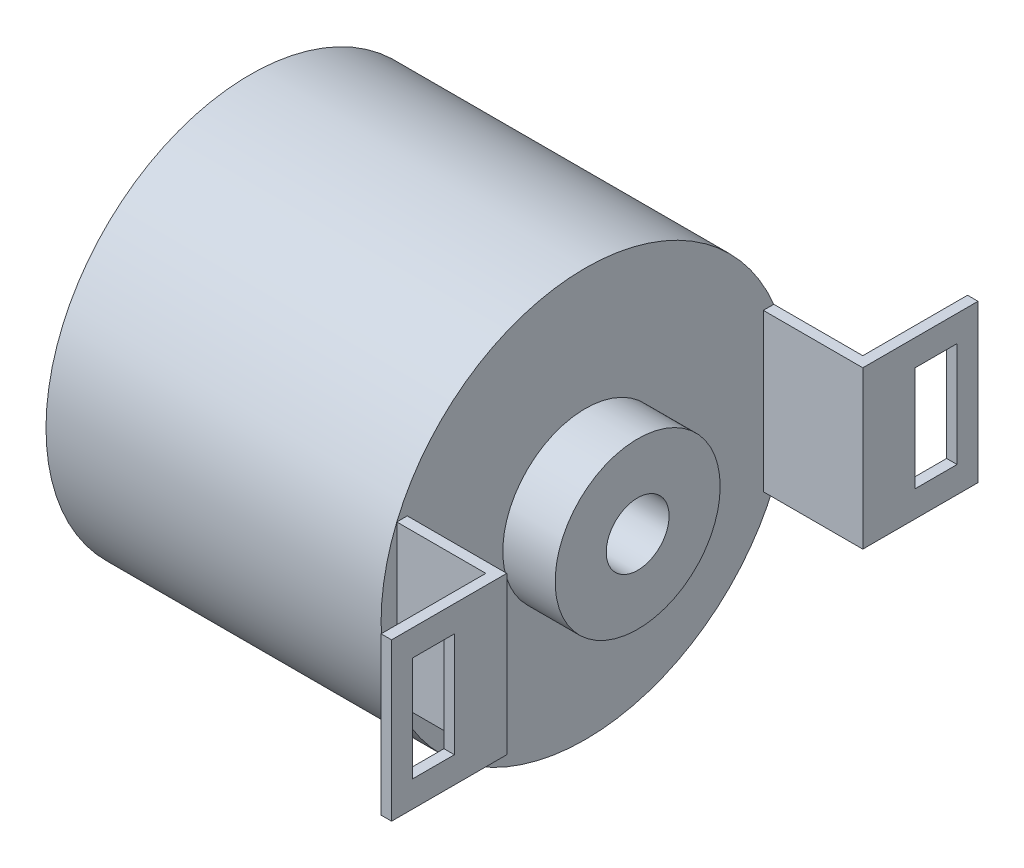
ISO-10303-21;
HEADER;
FILE_DESCRIPTION(('STEP AP214'),'2;1');
FILE_NAME('part.step','',(''),(''),'','','');
FILE_SCHEMA(('AUTOMOTIVE_DESIGN { 1 0 10303 214 1 1 1 1 }'));
ENDSEC;
DATA;
#1=APPLICATION_CONTEXT('core data for automotive mechanical design processes');
#2=APPLICATION_PROTOCOL_DEFINITION('international standard','automotive_design',2000,#1);
#3=PRODUCT_CONTEXT('',#1,'mechanical');
#4=PRODUCT('Part','Part','',(#3));
#5=PRODUCT_RELATED_PRODUCT_CATEGORY('part','',(#4));
#6=PRODUCT_DEFINITION_FORMATION('','',#4);
#7=PRODUCT_DEFINITION_CONTEXT('part definition',#1,'design');
#8=PRODUCT_DEFINITION('design','',#6,#7);
#9=PRODUCT_DEFINITION_SHAPE('','',#8);
#10=(LENGTH_UNIT() NAMED_UNIT(*) SI_UNIT(.MILLI.,.METRE.));
#11=(NAMED_UNIT(*) PLANE_ANGLE_UNIT() SI_UNIT($,.RADIAN.));
#12=(NAMED_UNIT(*) SI_UNIT($,.STERADIAN.) SOLID_ANGLE_UNIT());
#13=UNCERTAINTY_MEASURE_WITH_UNIT(LENGTH_MEASURE(1.E-05),#10,'distance_accuracy_value','');
#14=(GEOMETRIC_REPRESENTATION_CONTEXT(3) GLOBAL_UNCERTAINTY_ASSIGNED_CONTEXT((#13)) GLOBAL_UNIT_ASSIGNED_CONTEXT((#10,
#11,#12)) REPRESENTATION_CONTEXT('',''));
#15=CARTESIAN_POINT('',(0.,0.,0.));
#16=DIRECTION('',(0.,0.,1.));
#17=DIRECTION('',(1.,0.,0.));
#18=AXIS2_PLACEMENT_3D('',#15,#16,#17);
#19=CARTESIAN_POINT('',(41.5,0.,0.));
#20=DIRECTION('',(-1.,0.,0.));
#21=DIRECTION('',(0.,0.,-1.));
#22=AXIS2_PLACEMENT_3D('',#19,#20,#21);
#23=PLANE('',#22);
#24=DIRECTION('',(0.,0.,-1.));
#25=VECTOR('',#24,1.);
#26=CARTESIAN_POINT('',(41.5,7.5,17.));
#27=LINE('',#26,#25);
#28=CARTESIAN_POINT('',(41.5,7.5,28.));
#29=VERTEX_POINT('',#28);
#30=CARTESIAN_POINT('',(41.5,7.5,17.));
#31=VERTEX_POINT('',#30);
#32=EDGE_CURVE('E224',#29,#31,#27,.T.);
#33=ORIENTED_EDGE('',*,*,#32,.F.);
#34=DIRECTION('',(0.,-1.,0.));
#35=VECTOR('',#34,1.);
#36=CARTESIAN_POINT('',(41.5,7.5,28.));
#37=LINE('',#36,#35);
#38=CARTESIAN_POINT('',(41.5,-7.5,28.));
#39=VERTEX_POINT('',#38);
#40=EDGE_CURVE('E204',#29,#39,#37,.T.);
#41=ORIENTED_EDGE('',*,*,#40,.T.);
#42=DIRECTION('',(0.,0.,1.));
#43=VECTOR('',#42,1.);
#44=CARTESIAN_POINT('',(41.5,-7.5,18.));
#45=LINE('',#44,#43);
#46=CARTESIAN_POINT('',(41.5,-7.5,17.));
#47=VERTEX_POINT('',#46);
#48=EDGE_CURVE('E227',#47,#39,#45,.T.);
#49=ORIENTED_EDGE('',*,*,#48,.F.);
#50=DIRECTION('',(0.,-1.,0.));
#51=VECTOR('',#50,1.);
#52=CARTESIAN_POINT('',(41.5,-7.5,17.));
#53=LINE('',#52,#51);
#54=EDGE_CURVE('E230',#31,#47,#53,.T.);
#55=ORIENTED_EDGE('',*,*,#54,.F.);
#56=EDGE_LOOP('',(#33,#41,#49,#55));
#57=FACE_BOUND('',#56,.T.);
#58=DIRECTION('',(0.,-1.,0.));
#59=VECTOR('',#58,1.);
#60=CARTESIAN_POINT('',(41.5,5.,22.));
#61=LINE('',#60,#59);
#62=CARTESIAN_POINT('',(41.5,5.,22.));
#63=VERTEX_POINT('',#62);
#64=CARTESIAN_POINT('',(41.5,-5.,22.));
#65=VERTEX_POINT('',#64);
#66=EDGE_CURVE('E55',#63,#65,#61,.T.);
#67=ORIENTED_EDGE('',*,*,#66,.T.);
#68=DIRECTION('',(0.,0.,1.));
#69=VECTOR('',#68,1.);
#70=CARTESIAN_POINT('',(41.5,-5.,22.));
#71=LINE('',#70,#69);
#72=CARTESIAN_POINT('',(41.5,-5.,26.));
#73=VERTEX_POINT('',#72);
#74=EDGE_CURVE('E194',#65,#73,#71,.T.);
#75=ORIENTED_EDGE('',*,*,#74,.T.);
#76=DIRECTION('',(0.,1.,0.));
#77=VECTOR('',#76,1.);
#78=CARTESIAN_POINT('',(41.5,5.,26.));
#79=LINE('',#78,#77);
#80=CARTESIAN_POINT('',(41.5,5.,26.));
#81=VERTEX_POINT('',#80);
#82=EDGE_CURVE('E180',#73,#81,#79,.T.);
#83=ORIENTED_EDGE('',*,*,#82,.T.);
#84=DIRECTION('',(0.,0.,-1.));
#85=VECTOR('',#84,1.);
#86=CARTESIAN_POINT('',(41.5,5.,22.));
#87=LINE('',#86,#85);
#88=EDGE_CURVE('E189',#81,#63,#87,.T.);
#89=ORIENTED_EDGE('',*,*,#88,.T.);
#90=EDGE_LOOP('',(#67,#75,#83,#89));
#91=FACE_BOUND('',#90,.T.);
#92=ADVANCED_FACE('F40',(#57,#91),#23,.F.);
#93=CARTESIAN_POINT('',(40.5,7.5,28.));
#94=DIRECTION('',(-1.,0.,0.));
#95=DIRECTION('',(0.,0.,1.));
#96=AXIS2_PLACEMENT_3D('',#93,#94,#95);
#97=PLANE('',#96);
#98=DIRECTION('',(0.,1.,0.));
#99=VECTOR('',#98,1.);
#100=CARTESIAN_POINT('',(40.5,7.5,18.));
#101=LINE('',#100,#99);
#102=CARTESIAN_POINT('',(40.5,-7.5,18.));
#103=VERTEX_POINT('',#102);
#104=CARTESIAN_POINT('',(40.5,7.5,18.));
#105=VERTEX_POINT('',#104);
#106=EDGE_CURVE('E201',#103,#105,#101,.T.);
#107=ORIENTED_EDGE('',*,*,#106,.F.);
#108=DIRECTION('',(0.,0.,-1.));
#109=VECTOR('',#108,1.);
#110=CARTESIAN_POINT('',(40.5,-7.5,28.));
#111=LINE('',#110,#109);
#112=CARTESIAN_POINT('',(40.5,-7.5,28.));
#113=VERTEX_POINT('',#112);
#114=EDGE_CURVE('E216',#113,#103,#111,.T.);
#115=ORIENTED_EDGE('',*,*,#114,.F.);
#116=DIRECTION('',(0.,1.,0.));
#117=VECTOR('',#116,1.);
#118=CARTESIAN_POINT('',(40.5,7.5,28.));
#119=LINE('',#118,#117);
#120=CARTESIAN_POINT('',(40.5,7.5,28.));
#121=VERTEX_POINT('',#120);
#122=EDGE_CURVE('E210',#113,#121,#119,.T.);
#123=ORIENTED_EDGE('',*,*,#122,.T.);
#124=DIRECTION('',(0.,0.,-1.));
#125=VECTOR('',#124,1.);
#126=CARTESIAN_POINT('',(40.5,7.5,28.));
#127=LINE('',#126,#125);
#128=EDGE_CURVE('E220',#121,#105,#127,.T.);
#129=ORIENTED_EDGE('',*,*,#128,.T.);
#130=EDGE_LOOP('',(#107,#115,#123,#129));
#131=FACE_BOUND('',#130,.T.);
#132=DIRECTION('',(0.,0.,-1.));
#133=VECTOR('',#132,1.);
#134=CARTESIAN_POINT('',(40.5,-5.,28.));
#135=LINE('',#134,#133);
#136=CARTESIAN_POINT('',(40.5,-5.,26.));
#137=VERTEX_POINT('',#136);
#138=CARTESIAN_POINT('',(40.5,-5.,22.));
#139=VERTEX_POINT('',#138);
#140=EDGE_CURVE('E48',#137,#139,#135,.T.);
#141=ORIENTED_EDGE('',*,*,#140,.T.);
#142=DIRECTION('',(0.,1.,0.));
#143=VECTOR('',#142,1.);
#144=CARTESIAN_POINT('',(40.5,7.5,22.));
#145=LINE('',#144,#143);
#146=CARTESIAN_POINT('',(40.5,5.,22.));
#147=VERTEX_POINT('',#146);
#148=EDGE_CURVE('E11',#139,#147,#145,.T.);
#149=ORIENTED_EDGE('',*,*,#148,.T.);
#150=DIRECTION('',(0.,0.,1.));
#151=VECTOR('',#150,1.);
#152=CARTESIAN_POINT('',(40.5,5.,28.));
#153=LINE('',#152,#151);
#154=CARTESIAN_POINT('',(40.5,5.,26.));
#155=VERTEX_POINT('',#154);
#156=EDGE_CURVE('E349',#147,#155,#153,.T.);
#157=ORIENTED_EDGE('',*,*,#156,.T.);
#158=DIRECTION('',(0.,-1.,0.));
#159=VECTOR('',#158,1.);
#160=CARTESIAN_POINT('',(40.5,7.5,26.));
#161=LINE('',#160,#159);
#162=EDGE_CURVE('E183',#155,#137,#161,.T.);
#163=ORIENTED_EDGE('',*,*,#162,.T.);
#164=EDGE_LOOP('',(#141,#149,#157,#163));
#165=FACE_BOUND('',#164,.T.);
#166=ADVANCED_FACE('F353',(#131,#165),#97,.T.);
#167=CARTESIAN_POINT('',(32.,0.,0.));
#168=DIRECTION('',(1.,0.,0.));
#169=DIRECTION('',(0.,0.,-1.));
#170=AXIS2_PLACEMENT_3D('',#167,#168,#169);
#171=PLANE('',#170);
#172=DIRECTION('',(0.,0.,-1.));
#173=VECTOR('',#172,1.);
#174=CARTESIAN_POINT('',(32.,7.5,17.));
#175=LINE('',#174,#173);
#176=CARTESIAN_POINT('',(32.,7.5,18.));
#177=VERTEX_POINT('',#176);
#178=CARTESIAN_POINT('',(32.,7.5,17.));
#179=VERTEX_POINT('',#178);
#180=EDGE_CURVE('E223',#177,#179,#175,.T.);
#181=ORIENTED_EDGE('',*,*,#180,.T.);
#182=DIRECTION('',(0.,-1.,0.));
#183=VECTOR('',#182,1.);
#184=CARTESIAN_POINT('',(32.,-7.5,17.));
#185=LINE('',#184,#183);
#186=CARTESIAN_POINT('',(32.,-7.5,17.));
#187=VERTEX_POINT('',#186);
#188=EDGE_CURVE('E228',#179,#187,#185,.T.);
#189=ORIENTED_EDGE('',*,*,#188,.T.);
#190=DIRECTION('',(0.,0.,1.));
#191=VECTOR('',#190,1.);
#192=CARTESIAN_POINT('',(32.,-7.5,18.));
#193=LINE('',#192,#191);
#194=CARTESIAN_POINT('',(32.,-7.5,18.));
#195=VERTEX_POINT('',#194);
#196=EDGE_CURVE('E238',#187,#195,#193,.T.);
#197=ORIENTED_EDGE('',*,*,#196,.T.);
#198=CARTESIAN_POINT('',(32.,0.,0.));
#199=DIRECTION('',(1.,0.,0.));
#200=DIRECTION('',(0.,0.,-1.));
#201=AXIS2_PLACEMENT_3D('',#198,#199,#200);
#202=CIRCLE('',#201,19.5);
#203=CARTESIAN_POINT('',(32.,-7.5,-18.));
#204=VERTEX_POINT('',#203);
#205=EDGE_CURVE('E334',#195,#204,#202,.T.);
#206=ORIENTED_EDGE('',*,*,#205,.T.);
#207=DIRECTION('',(0.,0.,-1.));
#208=VECTOR('',#207,1.);
#209=CARTESIAN_POINT('',(32.,-7.5,-18.));
#210=LINE('',#209,#208);
#211=CARTESIAN_POINT('',(32.,-7.5,-17.));
#212=VERTEX_POINT('',#211);
#213=EDGE_CURVE('E302',#212,#204,#210,.T.);
#214=ORIENTED_EDGE('',*,*,#213,.F.);
#215=DIRECTION('',(0.,-1.,0.));
#216=VECTOR('',#215,1.);
#217=CARTESIAN_POINT('',(32.,-7.5,-17.));
#218=LINE('',#217,#216);
#219=CARTESIAN_POINT('',(32.,7.5,-17.));
#220=VERTEX_POINT('',#219);
#221=EDGE_CURVE('E300',#220,#212,#218,.T.);
#222=ORIENTED_EDGE('',*,*,#221,.F.);
#223=DIRECTION('',(0.,0.,1.));
#224=VECTOR('',#223,1.);
#225=CARTESIAN_POINT('',(32.,7.5,-17.));
#226=LINE('',#225,#224);
#227=CARTESIAN_POINT('',(32.,7.5,-18.));
#228=VERTEX_POINT('',#227);
#229=EDGE_CURVE('E288',#228,#220,#226,.T.);
#230=ORIENTED_EDGE('',*,*,#229,.F.);
#231=EDGE_CURVE('E330',#228,#177,#202,.T.);
#232=ORIENTED_EDGE('',*,*,#231,.T.);
#233=EDGE_LOOP('',(#181,#189,#197,#206,#214,#222,#230,#232));
#234=FACE_BOUND('',#233,.T.);
#235=CARTESIAN_POINT('',(32.,0.,0.));
#236=DIRECTION('',(1.,0.,0.));
#237=DIRECTION('',(0.,0.,-1.));
#238=AXIS2_PLACEMENT_3D('',#235,#236,#237);
#239=CIRCLE('',#238,7.88);
#240=CARTESIAN_POINT('',(32.,0.,-7.88));
#241=VERTEX_POINT('',#240);
#242=EDGE_CURVE('E326',#241,#241,#239,.T.);
#243=ORIENTED_EDGE('',*,*,#242,.F.);
#244=EDGE_LOOP('',(#243));
#245=FACE_BOUND('',#244,.T.);
#246=ADVANCED_FACE('F376',(#234,#245),#171,.T.);
#247=CARTESIAN_POINT('',(41.5,7.5,-18.));
#248=DIRECTION('',(0.,0.,1.));
#249=DIRECTION('',(1.,0.,0.));
#250=AXIS2_PLACEMENT_3D('',#247,#248,#249);
#251=PLANE('',#250);
#252=DIRECTION('',(0.,1.,0.));
#253=VECTOR('',#252,1.);
#254=CARTESIAN_POINT('',(40.5,7.5,-18.));
#255=LINE('',#254,#253);
#256=CARTESIAN_POINT('',(40.5,-7.5,-18.));
#257=VERTEX_POINT('',#256);
#258=CARTESIAN_POINT('',(40.5,7.5,-18.));
#259=VERTEX_POINT('',#258);
#260=EDGE_CURVE('E265',#257,#259,#255,.T.);
#261=ORIENTED_EDGE('',*,*,#260,.F.);
#262=DIRECTION('',(-1.,0.,0.));
#263=VECTOR('',#262,1.);
#264=CARTESIAN_POINT('',(41.5,-7.5,-18.));
#265=LINE('',#264,#263);
#266=EDGE_CURVE('E308',#257,#204,#265,.T.);
#267=ORIENTED_EDGE('',*,*,#266,.T.);
#268=DIRECTION('',(0.,1.,0.));
#269=VECTOR('',#268,1.);
#270=CARTESIAN_POINT('',(32.,7.5,-18.));
#271=LINE('',#270,#269);
#272=EDGE_CURVE('E293',#204,#228,#271,.T.);
#273=ORIENTED_EDGE('',*,*,#272,.T.);
#274=DIRECTION('',(-1.,0.,0.));
#275=VECTOR('',#274,1.);
#276=CARTESIAN_POINT('',(41.5,7.5,-18.));
#277=LINE('',#276,#275);
#278=EDGE_CURVE('E297',#259,#228,#277,.T.);
#279=ORIENTED_EDGE('',*,*,#278,.F.);
#280=EDGE_LOOP('',(#261,#267,#273,#279));
#281=FACE_BOUND('',#280,.T.);
#282=ADVANCED_FACE('F424',(#281),#251,.F.);
#283=DIRECTION('',(0.,1.,0.));
#284=VECTOR('',#283,1.);
#285=CARTESIAN_POINT('',(32.,7.5,18.));
#286=LINE('',#285,#284);
#287=EDGE_CURVE('E235',#195,#177,#286,.T.);
#288=ORIENTED_EDGE('',*,*,#287,.T.);
#289=EDGE_CURVE('E333',#177,#195,#202,.T.);
#290=ORIENTED_EDGE('',*,*,#289,.T.);
#291=EDGE_LOOP('',(#288,#290));
#292=FACE_BOUND('',#291,.T.);
#293=ADVANCED_FACE('F427',(#292),#171,.T.);
#294=EDGE_CURVE('E335',#204,#228,#202,.T.);
#295=ORIENTED_EDGE('',*,*,#294,.T.);
#296=ORIENTED_EDGE('',*,*,#272,.F.);
#297=EDGE_LOOP('',(#295,#296));
#298=FACE_BOUND('',#297,.T.);
#299=ADVANCED_FACE('F454',(#298),#171,.T.);
#300=CARTESIAN_POINT('',(32.,0.,0.));
#301=DIRECTION('',(-1.,0.,0.));
#302=DIRECTION('',(0.,0.,1.));
#303=AXIS2_PLACEMENT_3D('',#300,#301,#302);
#304=CYLINDRICAL_SURFACE('',#303,19.5);
#305=ORIENTED_EDGE('',*,*,#231,.F.);
#306=ORIENTED_EDGE('',*,*,#294,.F.);
#307=ORIENTED_EDGE('',*,*,#205,.F.);
#308=ORIENTED_EDGE('',*,*,#289,.F.);
#309=EDGE_LOOP('',(#305,#306,#307,#308));
#310=FACE_BOUND('',#309,.T.);
#311=CARTESIAN_POINT('',(0.,0.,0.));
#312=DIRECTION('',(1.,0.,0.));
#313=DIRECTION('',(0.,0.,-1.));
#314=AXIS2_PLACEMENT_3D('',#311,#312,#313);
#315=CIRCLE('',#314,19.5);
#316=CARTESIAN_POINT('',(0.,0.,-19.5));
#317=VERTEX_POINT('',#316);
#318=EDGE_CURVE('E325',#317,#317,#315,.T.);
#319=ORIENTED_EDGE('',*,*,#318,.T.);
#320=EDGE_LOOP('',(#319));
#321=FACE_BOUND('',#320,.T.);
#322=ADVANCED_FACE('F42',(#310,#321),#304,.T.);
#323=CARTESIAN_POINT('',(0.,0.,0.));
#324=DIRECTION('',(1.,0.,0.));
#325=DIRECTION('',(0.,0.,-1.));
#326=AXIS2_PLACEMENT_3D('',#323,#324,#325);
#327=PLANE('',#326);
#328=CARTESIAN_POINT('',(0.,0.,0.));
#329=DIRECTION('',(1.,0.,0.));
#330=DIRECTION('',(0.,0.,-1.));
#331=AXIS2_PLACEMENT_3D('',#328,#329,#330);
#332=CIRCLE('',#331,3.);
#333=CARTESIAN_POINT('',(0.,0.,-3.));
#334=VERTEX_POINT('',#333);
#335=EDGE_CURVE('E319',#334,#334,#332,.F.);
#336=ORIENTED_EDGE('',*,*,#335,.F.);
#337=EDGE_LOOP('',(#336));
#338=FACE_BOUND('',#337,.T.);
#339=ORIENTED_EDGE('',*,*,#318,.F.);
#340=EDGE_LOOP('',(#339));
#341=FACE_BOUND('',#340,.T.);
#342=ADVANCED_FACE('F451',(#338,#341),#327,.F.);
#343=CARTESIAN_POINT('',(37.,0.,0.));
#344=DIRECTION('',(-1.,0.,0.));
#345=DIRECTION('',(0.,0.,1.));
#346=AXIS2_PLACEMENT_3D('',#343,#344,#345);
#347=CYLINDRICAL_SURFACE('',#346,7.88);
#348=CARTESIAN_POINT('',(37.,0.,0.));
#349=DIRECTION('',(1.,0.,0.));
#350=DIRECTION('',(0.,0.,-1.));
#351=AXIS2_PLACEMENT_3D('',#348,#349,#350);
#352=CIRCLE('',#351,7.88);
#353=CARTESIAN_POINT('',(37.,0.,-7.88));
#354=VERTEX_POINT('',#353);
#355=EDGE_CURVE('E322',#354,#354,#352,.T.);
#356=ORIENTED_EDGE('',*,*,#355,.F.);
#357=EDGE_LOOP('',(#356));
#358=FACE_BOUND('',#357,.T.);
#359=ORIENTED_EDGE('',*,*,#242,.T.);
#360=EDGE_LOOP('',(#359));
#361=FACE_BOUND('',#360,.T.);
#362=ADVANCED_FACE('F447',(#358,#361),#347,.T.);
#363=CARTESIAN_POINT('',(37.,0.,0.));
#364=DIRECTION('',(1.,0.,0.));
#365=DIRECTION('',(0.,0.,-1.));
#366=AXIS2_PLACEMENT_3D('',#363,#364,#365);
#367=PLANE('',#366);
#368=CARTESIAN_POINT('',(37.,0.,0.));
#369=DIRECTION('',(1.,0.,0.));
#370=DIRECTION('',(0.,0.,-1.));
#371=AXIS2_PLACEMENT_3D('',#368,#369,#370);
#372=CIRCLE('',#371,3.);
#373=CARTESIAN_POINT('',(37.,0.,-3.));
#374=VERTEX_POINT('',#373);
#375=EDGE_CURVE('E316',#374,#374,#372,.T.);
#376=ORIENTED_EDGE('',*,*,#375,.F.);
#377=EDGE_LOOP('',(#376));
#378=FACE_BOUND('',#377,.T.);
#379=ORIENTED_EDGE('',*,*,#355,.T.);
#380=EDGE_LOOP('',(#379));
#381=FACE_BOUND('',#380,.T.);
#382=ADVANCED_FACE('F443',(#378,#381),#367,.T.);
#383=CARTESIAN_POINT('',(-0.001000000000001,0.,0.));
#384=DIRECTION('',(1.,0.,0.));
#385=DIRECTION('',(0.,0.,-1.));
#386=AXIS2_PLACEMENT_3D('',#383,#384,#385);
#387=CYLINDRICAL_SURFACE('',#386,3.);
#388=ORIENTED_EDGE('',*,*,#375,.T.);
#389=EDGE_LOOP('',(#388));
#390=FACE_BOUND('',#389,.T.);
#391=ORIENTED_EDGE('',*,*,#335,.T.);
#392=EDGE_LOOP('',(#391));
#393=FACE_BOUND('',#392,.T.);
#394=ADVANCED_FACE('F439',(#390,#393),#387,.F.);
#395=CARTESIAN_POINT('',(41.5,7.5,-17.));
#396=DIRECTION('',(0.,-1.,0.));
#397=DIRECTION('',(0.,0.,-1.));
#398=AXIS2_PLACEMENT_3D('',#395,#396,#397);
#399=PLANE('',#398);
#400=ORIENTED_EDGE('',*,*,#229,.T.);
#401=DIRECTION('',(-1.,0.,0.));
#402=VECTOR('',#401,1.);
#403=CARTESIAN_POINT('',(41.5,7.5,-17.));
#404=LINE('',#403,#402);
#405=CARTESIAN_POINT('',(41.5,7.5,-17.));
#406=VERTEX_POINT('',#405);
#407=EDGE_CURVE('E314',#406,#220,#404,.T.);
#408=ORIENTED_EDGE('',*,*,#407,.F.);
#409=DIRECTION('',(0.,0.,1.));
#410=VECTOR('',#409,1.);
#411=CARTESIAN_POINT('',(41.5,7.5,-17.));
#412=LINE('',#411,#410);
#413=CARTESIAN_POINT('',(41.5,7.5,-28.));
#414=VERTEX_POINT('',#413);
#415=EDGE_CURVE('E289',#414,#406,#412,.T.);
#416=ORIENTED_EDGE('',*,*,#415,.F.);
#417=DIRECTION('',(1.,0.,0.));
#418=VECTOR('',#417,1.);
#419=CARTESIAN_POINT('',(41.5,7.5,-28.));
#420=LINE('',#419,#418);
#421=CARTESIAN_POINT('',(40.5,7.5,-28.));
#422=VERTEX_POINT('',#421);
#423=EDGE_CURVE('E279',#422,#414,#420,.T.);
#424=ORIENTED_EDGE('',*,*,#423,.F.);
#425=DIRECTION('',(0.,0.,1.));
#426=VECTOR('',#425,1.);
#427=CARTESIAN_POINT('',(40.5,7.5,-28.));
#428=LINE('',#427,#426);
#429=EDGE_CURVE('E282',#422,#259,#428,.T.);
#430=ORIENTED_EDGE('',*,*,#429,.T.);
#431=ORIENTED_EDGE('',*,*,#278,.T.);
#432=EDGE_LOOP('',(#400,#408,#416,#424,#430,#431));
#433=FACE_BOUND('',#432,.T.);
#434=ADVANCED_FACE('F435',(#433),#399,.F.);
#435=CARTESIAN_POINT('',(41.5,-7.5,-17.));
#436=DIRECTION('',(0.,0.,-1.));
#437=DIRECTION('',(-1.,0.,0.));
#438=AXIS2_PLACEMENT_3D('',#435,#436,#437);
#439=PLANE('',#438);
#440=ORIENTED_EDGE('',*,*,#221,.T.);
#441=DIRECTION('',(-1.,0.,0.));
#442=VECTOR('',#441,1.);
#443=CARTESIAN_POINT('',(41.5,-7.5,-17.));
#444=LINE('',#443,#442);
#445=CARTESIAN_POINT('',(41.5,-7.5,-17.));
#446=VERTEX_POINT('',#445);
#447=EDGE_CURVE('E311',#446,#212,#444,.T.);
#448=ORIENTED_EDGE('',*,*,#447,.F.);
#449=DIRECTION('',(0.,-1.,0.));
#450=VECTOR('',#449,1.);
#451=CARTESIAN_POINT('',(41.5,-7.5,-17.));
#452=LINE('',#451,#450);
#453=EDGE_CURVE('E292',#406,#446,#452,.T.);
#454=ORIENTED_EDGE('',*,*,#453,.F.);
#455=ORIENTED_EDGE('',*,*,#407,.T.);
#456=EDGE_LOOP('',(#440,#448,#454,#455));
#457=FACE_BOUND('',#456,.T.);
#458=ADVANCED_FACE('F431',(#457),#439,.F.);
#459=CARTESIAN_POINT('',(41.5,-7.5,-18.));
#460=DIRECTION('',(0.,1.,0.));
#461=DIRECTION('',(0.,0.,1.));
#462=AXIS2_PLACEMENT_3D('',#459,#460,#461);
#463=PLANE('',#462);
#464=ORIENTED_EDGE('',*,*,#213,.T.);
#465=ORIENTED_EDGE('',*,*,#266,.F.);
#466=DIRECTION('',(0.,0.,1.));
#467=VECTOR('',#466,1.);
#468=CARTESIAN_POINT('',(40.5,-7.5,-28.));
#469=LINE('',#468,#467);
#470=CARTESIAN_POINT('',(40.5,-7.5,-28.));
#471=VERTEX_POINT('',#470);
#472=EDGE_CURVE('E286',#471,#257,#469,.T.);
#473=ORIENTED_EDGE('',*,*,#472,.F.);
#474=DIRECTION('',(-1.,0.,0.));
#475=VECTOR('',#474,1.);
#476=CARTESIAN_POINT('',(41.5,-7.5,-28.));
#477=LINE('',#476,#475);
#478=CARTESIAN_POINT('',(41.5,-7.5,-28.));
#479=VERTEX_POINT('',#478);
#480=EDGE_CURVE('E275',#479,#471,#477,.T.);
#481=ORIENTED_EDGE('',*,*,#480,.F.);
#482=DIRECTION('',(0.,0.,-1.));
#483=VECTOR('',#482,1.);
#484=CARTESIAN_POINT('',(41.5,-7.5,-18.));
#485=LINE('',#484,#483);
#486=EDGE_CURVE('E295',#446,#479,#485,.T.);
#487=ORIENTED_EDGE('',*,*,#486,.F.);
#488=ORIENTED_EDGE('',*,*,#447,.T.);
#489=EDGE_LOOP('',(#464,#465,#473,#481,#487,#488));
#490=FACE_BOUND('',#489,.T.);
#491=ADVANCED_FACE('F422',(#490),#463,.F.);
#492=CARTESIAN_POINT('',(41.5,0.,0.));
#493=DIRECTION('',(-1.,0.,0.));
#494=DIRECTION('',(0.,0.,1.));
#495=AXIS2_PLACEMENT_3D('',#492,#493,#494);
#496=PLANE('',#495);
#497=DIRECTION('',(0.,0.,-1.));
#498=VECTOR('',#497,1.);
#499=CARTESIAN_POINT('',(41.5,-5.,-22.));
#500=LINE('',#499,#498);
#501=CARTESIAN_POINT('',(41.5,-5.,-22.));
#502=VERTEX_POINT('',#501);
#503=CARTESIAN_POINT('',(41.5,-5.,-26.));
#504=VERTEX_POINT('',#503);
#505=EDGE_CURVE('E253',#502,#504,#500,.T.);
#506=ORIENTED_EDGE('',*,*,#505,.F.);
#507=DIRECTION('',(0.,-1.,0.));
#508=VECTOR('',#507,1.);
#509=CARTESIAN_POINT('',(41.5,5.,-22.));
#510=LINE('',#509,#508);
#511=CARTESIAN_POINT('',(41.5,5.,-22.));
#512=VERTEX_POINT('',#511);
#513=EDGE_CURVE('E251',#512,#502,#510,.T.);
#514=ORIENTED_EDGE('',*,*,#513,.F.);
#515=DIRECTION('',(0.,0.,1.));
#516=VECTOR('',#515,1.);
#517=CARTESIAN_POINT('',(41.5,5.,-22.));
#518=LINE('',#517,#516);
#519=CARTESIAN_POINT('',(41.5,5.,-26.));
#520=VERTEX_POINT('',#519);
#521=EDGE_CURVE('E259',#520,#512,#518,.T.);
#522=ORIENTED_EDGE('',*,*,#521,.F.);
#523=DIRECTION('',(0.,1.,0.));
#524=VECTOR('',#523,1.);
#525=CARTESIAN_POINT('',(41.5,5.,-26.));
#526=LINE('',#525,#524);
#527=EDGE_CURVE('E256',#504,#520,#526,.T.);
#528=ORIENTED_EDGE('',*,*,#527,.F.);
#529=EDGE_LOOP('',(#506,#514,#522,#528));
#530=FACE_BOUND('',#529,.T.);
#531=ORIENTED_EDGE('',*,*,#415,.T.);
#532=ORIENTED_EDGE('',*,*,#453,.T.);
#533=ORIENTED_EDGE('',*,*,#486,.T.);
#534=DIRECTION('',(0.,-1.,0.));
#535=VECTOR('',#534,1.);
#536=CARTESIAN_POINT('',(41.5,7.5,-28.));
#537=LINE('',#536,#535);
#538=EDGE_CURVE('E272',#414,#479,#537,.T.);
#539=ORIENTED_EDGE('',*,*,#538,.F.);
#540=EDGE_LOOP('',(#531,#532,#533,#539));
#541=FACE_BOUND('',#540,.T.);
#542=ADVANCED_FACE('F418',(#530,#541),#496,.F.);
#543=CARTESIAN_POINT('',(40.5,7.5,-28.));
#544=DIRECTION('',(1.,0.,0.));
#545=DIRECTION('',(0.,0.,-1.));
#546=AXIS2_PLACEMENT_3D('',#543,#544,#545);
#547=PLANE('',#546);
#548=DIRECTION('',(0.,0.,1.));
#549=VECTOR('',#548,1.);
#550=CARTESIAN_POINT('',(40.5,5.,-28.));
#551=LINE('',#550,#549);
#552=CARTESIAN_POINT('',(40.5,5.,-26.));
#553=VERTEX_POINT('',#552);
#554=CARTESIAN_POINT('',(40.5,5.,-22.));
#555=VERTEX_POINT('',#554);
#556=EDGE_CURVE('E343',#553,#555,#551,.T.);
#557=ORIENTED_EDGE('',*,*,#556,.T.);
#558=DIRECTION('',(0.,-1.,0.));
#559=VECTOR('',#558,1.);
#560=CARTESIAN_POINT('',(40.5,7.5,-22.));
#561=LINE('',#560,#559);
#562=CARTESIAN_POINT('',(40.5,-5.,-22.));
#563=VERTEX_POINT('',#562);
#564=EDGE_CURVE('E346',#555,#563,#561,.T.);
#565=ORIENTED_EDGE('',*,*,#564,.T.);
#566=DIRECTION('',(0.,0.,-1.));
#567=VECTOR('',#566,1.);
#568=CARTESIAN_POINT('',(40.5,-5.,-28.));
#569=LINE('',#568,#567);
#570=CARTESIAN_POINT('',(40.5,-5.,-26.));
#571=VERTEX_POINT('',#570);
#572=EDGE_CURVE('E329',#563,#571,#569,.T.);
#573=ORIENTED_EDGE('',*,*,#572,.T.);
#574=DIRECTION('',(0.,1.,0.));
#575=VECTOR('',#574,1.);
#576=CARTESIAN_POINT('',(40.5,7.5,-26.));
#577=LINE('',#576,#575);
#578=EDGE_CURVE('E340',#571,#553,#577,.T.);
#579=ORIENTED_EDGE('',*,*,#578,.T.);
#580=EDGE_LOOP('',(#557,#565,#573,#579));
#581=FACE_BOUND('',#580,.T.);
#582=ORIENTED_EDGE('',*,*,#260,.T.);
#583=ORIENTED_EDGE('',*,*,#429,.F.);
#584=DIRECTION('',(0.,1.,0.));
#585=VECTOR('',#584,1.);
#586=CARTESIAN_POINT('',(40.5,7.5,-28.));
#587=LINE('',#586,#585);
#588=EDGE_CURVE('E277',#471,#422,#587,.T.);
#589=ORIENTED_EDGE('',*,*,#588,.F.);
#590=ORIENTED_EDGE('',*,*,#472,.T.);
#591=EDGE_LOOP('',(#582,#583,#589,#590));
#592=FACE_BOUND('',#591,.T.);
#593=ADVANCED_FACE('F414',(#581,#592),#547,.F.);
#594=CARTESIAN_POINT('',(0.,0.,-28.));
#595=DIRECTION('',(0.,0.,-1.));
#596=DIRECTION('',(-1.,0.,0.));
#597=AXIS2_PLACEMENT_3D('',#594,#595,#596);
#598=PLANE('',#597);
#599=ORIENTED_EDGE('',*,*,#538,.T.);
#600=ORIENTED_EDGE('',*,*,#480,.T.);
#601=ORIENTED_EDGE('',*,*,#588,.T.);
#602=ORIENTED_EDGE('',*,*,#423,.T.);
#603=EDGE_LOOP('',(#599,#600,#601,#602));
#604=FACE_BOUND('',#603,.T.);
#605=ADVANCED_FACE('F410',(#604),#598,.T.);
#606=CARTESIAN_POINT('',(31.5,5.,-22.));
#607=DIRECTION('',(0.,0.,1.));
#608=DIRECTION('',(1.,0.,0.));
#609=AXIS2_PLACEMENT_3D('',#606,#607,#608);
#610=PLANE('',#609);
#611=DIRECTION('',(1.,0.,0.));
#612=VECTOR('',#611,1.);
#613=CARTESIAN_POINT('',(31.5,5.,-22.));
#614=LINE('',#613,#612);
#615=EDGE_CURVE('E263',#555,#512,#614,.T.);
#616=ORIENTED_EDGE('',*,*,#615,.T.);
#617=ORIENTED_EDGE('',*,*,#513,.T.);
#618=DIRECTION('',(1.,0.,0.));
#619=VECTOR('',#618,1.);
#620=CARTESIAN_POINT('',(31.5,-5.,-22.));
#621=LINE('',#620,#619);
#622=EDGE_CURVE('E262',#563,#502,#621,.T.);
#623=ORIENTED_EDGE('',*,*,#622,.F.);
#624=ORIENTED_EDGE('',*,*,#564,.F.);
#625=EDGE_LOOP('',(#616,#617,#623,#624));
#626=FACE_BOUND('',#625,.T.);
#627=ADVANCED_FACE('F400',(#626),#610,.F.);
#628=CARTESIAN_POINT('',(31.5,5.,-22.));
#629=DIRECTION('',(0.,1.,0.));
#630=DIRECTION('',(0.,0.,1.));
#631=AXIS2_PLACEMENT_3D('',#628,#629,#630);
#632=PLANE('',#631);
#633=DIRECTION('',(1.,0.,0.));
#634=VECTOR('',#633,1.);
#635=CARTESIAN_POINT('',(31.5,5.,-26.));
#636=LINE('',#635,#634);
#637=EDGE_CURVE('E266',#553,#520,#636,.T.);
#638=ORIENTED_EDGE('',*,*,#637,.T.);
#639=ORIENTED_EDGE('',*,*,#521,.T.);
#640=ORIENTED_EDGE('',*,*,#615,.F.);
#641=ORIENTED_EDGE('',*,*,#556,.F.);
#642=EDGE_LOOP('',(#638,#639,#640,#641));
#643=FACE_BOUND('',#642,.T.);
#644=ADVANCED_FACE('F396',(#643),#632,.F.);
#645=CARTESIAN_POINT('',(31.5,5.,-26.));
#646=DIRECTION('',(0.,0.,-1.));
#647=DIRECTION('',(-1.,0.,0.));
#648=AXIS2_PLACEMENT_3D('',#645,#646,#647);
#649=PLANE('',#648);
#650=DIRECTION('',(1.,0.,0.));
#651=VECTOR('',#650,1.);
#652=CARTESIAN_POINT('',(31.5,-5.,-26.));
#653=LINE('',#652,#651);
#654=EDGE_CURVE('E268',#571,#504,#653,.T.);
#655=ORIENTED_EDGE('',*,*,#654,.T.);
#656=ORIENTED_EDGE('',*,*,#527,.T.);
#657=ORIENTED_EDGE('',*,*,#637,.F.);
#658=ORIENTED_EDGE('',*,*,#578,.F.);
#659=EDGE_LOOP('',(#655,#656,#657,#658));
#660=FACE_BOUND('',#659,.T.);
#661=ADVANCED_FACE('F399',(#660),#649,.F.);
#662=CARTESIAN_POINT('',(31.5,-5.,-22.));
#663=DIRECTION('',(0.,-1.,0.));
#664=DIRECTION('',(0.,0.,-1.));
#665=AXIS2_PLACEMENT_3D('',#662,#663,#664);
#666=PLANE('',#665);
#667=ORIENTED_EDGE('',*,*,#622,.T.);
#668=ORIENTED_EDGE('',*,*,#505,.T.);
#669=ORIENTED_EDGE('',*,*,#654,.F.);
#670=ORIENTED_EDGE('',*,*,#572,.F.);
#671=EDGE_LOOP('',(#667,#668,#669,#670));
#672=FACE_BOUND('',#671,.T.);
#673=ADVANCED_FACE('F394',(#672),#666,.F.);
#674=CARTESIAN_POINT('',(41.5,7.5,17.));
#675=DIRECTION('',(0.,1.,0.));
#676=DIRECTION('',(0.,0.,1.));
#677=AXIS2_PLACEMENT_3D('',#674,#675,#676);
#678=PLANE('',#677);
#679=ORIENTED_EDGE('',*,*,#180,.F.);
#680=DIRECTION('',(-1.,0.,0.));
#681=VECTOR('',#680,1.);
#682=CARTESIAN_POINT('',(41.5,7.5,18.));
#683=LINE('',#682,#681);
#684=EDGE_CURVE('E249',#105,#177,#683,.T.);
#685=ORIENTED_EDGE('',*,*,#684,.F.);
#686=ORIENTED_EDGE('',*,*,#128,.F.);
#687=DIRECTION('',(1.,0.,0.));
#688=VECTOR('',#687,1.);
#689=CARTESIAN_POINT('',(41.5,7.5,28.));
#690=LINE('',#689,#688);
#691=EDGE_CURVE('E207',#121,#29,#690,.T.);
#692=ORIENTED_EDGE('',*,*,#691,.T.);
#693=ORIENTED_EDGE('',*,*,#32,.T.);
#694=DIRECTION('',(-1.,0.,0.));
#695=VECTOR('',#694,1.);
#696=CARTESIAN_POINT('',(41.5,7.5,17.));
#697=LINE('',#696,#695);
#698=EDGE_CURVE('E233',#31,#179,#697,.T.);
#699=ORIENTED_EDGE('',*,*,#698,.T.);
#700=EDGE_LOOP('',(#679,#685,#686,#692,#693,#699));
#701=FACE_BOUND('',#700,.T.);
#702=ADVANCED_FACE('F390',(#701),#678,.T.);
#703=CARTESIAN_POINT('',(41.5,7.5,18.));
#704=DIRECTION('',(0.,0.,1.));
#705=DIRECTION('',(1.,0.,0.));
#706=AXIS2_PLACEMENT_3D('',#703,#704,#705);
#707=PLANE('',#706);
#708=ORIENTED_EDGE('',*,*,#106,.T.);
#709=ORIENTED_EDGE('',*,*,#684,.T.);
#710=ORIENTED_EDGE('',*,*,#287,.F.);
#711=DIRECTION('',(-1.,0.,0.));
#712=VECTOR('',#711,1.);
#713=CARTESIAN_POINT('',(41.5,-7.5,18.));
#714=LINE('',#713,#712);
#715=EDGE_CURVE('E247',#103,#195,#714,.T.);
#716=ORIENTED_EDGE('',*,*,#715,.F.);
#717=EDGE_LOOP('',(#708,#709,#710,#716));
#718=FACE_BOUND('',#717,.T.);
#719=ADVANCED_FACE('F386',(#718),#707,.T.);
#720=CARTESIAN_POINT('',(41.5,-7.5,18.));
#721=DIRECTION('',(0.,-1.,0.));
#722=DIRECTION('',(0.,0.,-1.));
#723=AXIS2_PLACEMENT_3D('',#720,#721,#722);
#724=PLANE('',#723);
#725=ORIENTED_EDGE('',*,*,#196,.F.);
#726=DIRECTION('',(-1.,0.,0.));
#727=VECTOR('',#726,1.);
#728=CARTESIAN_POINT('',(41.5,-7.5,17.));
#729=LINE('',#728,#727);
#730=EDGE_CURVE('E244',#47,#187,#729,.T.);
#731=ORIENTED_EDGE('',*,*,#730,.F.);
#732=ORIENTED_EDGE('',*,*,#48,.T.);
#733=DIRECTION('',(-1.,0.,0.));
#734=VECTOR('',#733,1.);
#735=CARTESIAN_POINT('',(41.5,-7.5,28.));
#736=LINE('',#735,#734);
#737=EDGE_CURVE('E213',#39,#113,#736,.T.);
#738=ORIENTED_EDGE('',*,*,#737,.T.);
#739=ORIENTED_EDGE('',*,*,#114,.T.);
#740=ORIENTED_EDGE('',*,*,#715,.T.);
#741=EDGE_LOOP('',(#725,#731,#732,#738,#739,#740));
#742=FACE_BOUND('',#741,.T.);
#743=ADVANCED_FACE('F382',(#742),#724,.T.);
#744=CARTESIAN_POINT('',(41.5,-7.5,17.));
#745=DIRECTION('',(0.,0.,-1.));
#746=DIRECTION('',(-1.,0.,0.));
#747=AXIS2_PLACEMENT_3D('',#744,#745,#746);
#748=PLANE('',#747);
#749=ORIENTED_EDGE('',*,*,#188,.F.);
#750=ORIENTED_EDGE('',*,*,#698,.F.);
#751=ORIENTED_EDGE('',*,*,#54,.T.);
#752=ORIENTED_EDGE('',*,*,#730,.T.);
#753=EDGE_LOOP('',(#749,#750,#751,#752));
#754=FACE_BOUND('',#753,.T.);
#755=ADVANCED_FACE('F366',(#754),#748,.T.);
#756=CARTESIAN_POINT('',(0.,0.,28.));
#757=DIRECTION('',(0.,0.,1.));
#758=DIRECTION('',(-1.,0.,0.));
#759=AXIS2_PLACEMENT_3D('',#756,#757,#758);
#760=PLANE('',#759);
#761=ORIENTED_EDGE('',*,*,#40,.F.);
#762=ORIENTED_EDGE('',*,*,#691,.F.);
#763=ORIENTED_EDGE('',*,*,#122,.F.);
#764=ORIENTED_EDGE('',*,*,#737,.F.);
#765=EDGE_LOOP('',(#761,#762,#763,#764));
#766=FACE_BOUND('',#765,.T.);
#767=ADVANCED_FACE('F359',(#766),#760,.T.);
#768=CARTESIAN_POINT('',(31.5,5.,22.));
#769=DIRECTION('',(0.,0.,1.));
#770=DIRECTION('',(1.,0.,0.));
#771=AXIS2_PLACEMENT_3D('',#768,#769,#770);
#772=PLANE('',#771);
#773=DIRECTION('',(1.,0.,0.));
#774=VECTOR('',#773,1.);
#775=CARTESIAN_POINT('',(31.5,-5.,22.));
#776=LINE('',#775,#774);
#777=EDGE_CURVE('E199',#139,#65,#776,.T.);
#778=ORIENTED_EDGE('',*,*,#777,.T.);
#779=ORIENTED_EDGE('',*,*,#66,.F.);
#780=DIRECTION('',(1.,0.,0.));
#781=VECTOR('',#780,1.);
#782=CARTESIAN_POINT('',(31.5,5.,22.));
#783=LINE('',#782,#781);
#784=EDGE_CURVE('E186',#147,#63,#783,.T.);
#785=ORIENTED_EDGE('',*,*,#784,.F.);
#786=ORIENTED_EDGE('',*,*,#148,.F.);
#787=EDGE_LOOP('',(#778,#779,#785,#786));
#788=FACE_BOUND('',#787,.T.);
#789=ADVANCED_FACE('F357',(#788),#772,.T.);
#790=CARTESIAN_POINT('',(31.5,-5.,22.));
#791=DIRECTION('',(0.,1.,0.));
#792=DIRECTION('',(0.,0.,1.));
#793=AXIS2_PLACEMENT_3D('',#790,#791,#792);
#794=PLANE('',#793);
#795=DIRECTION('',(1.,0.,0.));
#796=VECTOR('',#795,1.);
#797=CARTESIAN_POINT('',(31.5,-5.,26.));
#798=LINE('',#797,#796);
#799=EDGE_CURVE('E185',#137,#73,#798,.T.);
#800=ORIENTED_EDGE('',*,*,#799,.T.);
#801=ORIENTED_EDGE('',*,*,#74,.F.);
#802=ORIENTED_EDGE('',*,*,#777,.F.);
#803=ORIENTED_EDGE('',*,*,#140,.F.);
#804=EDGE_LOOP('',(#800,#801,#802,#803));
#805=FACE_BOUND('',#804,.T.);
#806=ADVANCED_FACE('F356',(#805),#794,.T.);
#807=CARTESIAN_POINT('',(31.5,5.,26.));
#808=DIRECTION('',(0.,0.,-1.));
#809=DIRECTION('',(-1.,0.,0.));
#810=AXIS2_PLACEMENT_3D('',#807,#808,#809);
#811=PLANE('',#810);
#812=DIRECTION('',(1.,0.,0.));
#813=VECTOR('',#812,1.);
#814=CARTESIAN_POINT('',(31.5,5.,26.));
#815=LINE('',#814,#813);
#816=EDGE_CURVE('E63',#155,#81,#815,.T.);
#817=ORIENTED_EDGE('',*,*,#816,.T.);
#818=ORIENTED_EDGE('',*,*,#82,.F.);
#819=ORIENTED_EDGE('',*,*,#799,.F.);
#820=ORIENTED_EDGE('',*,*,#162,.F.);
#821=EDGE_LOOP('',(#817,#818,#819,#820));
#822=FACE_BOUND('',#821,.T.);
#823=ADVANCED_FACE('F177',(#822),#811,.T.);
#824=CARTESIAN_POINT('',(31.5,5.,22.));
#825=DIRECTION('',(0.,-1.,0.));
#826=DIRECTION('',(0.,0.,-1.));
#827=AXIS2_PLACEMENT_3D('',#824,#825,#826);
#828=PLANE('',#827);
#829=ORIENTED_EDGE('',*,*,#784,.T.);
#830=ORIENTED_EDGE('',*,*,#88,.F.);
#831=ORIENTED_EDGE('',*,*,#816,.F.);
#832=ORIENTED_EDGE('',*,*,#156,.F.);
#833=EDGE_LOOP('',(#829,#830,#831,#832));
#834=FACE_BOUND('',#833,.T.);
#835=ADVANCED_FACE('F190',(#834),#828,.T.);
#836=CLOSED_SHELL('',(#92,#166,#246,#282,#293,#299,#322,#342,#362,#382,#394,#434,#458,#491,#542,
#593,#605,#627,#644,#661,#673,#702,#719,#743,#755,#767,#789,#806,#823,#835));
#837=MANIFOLD_SOLID_BREP('B2',#836);
#838=ADVANCED_BREP_SHAPE_REPRESENTATION('',(#18,#837),#14);
#839=SHAPE_DEFINITION_REPRESENTATION(#9,#838);
ENDSEC;
END-ISO-10303-21;
